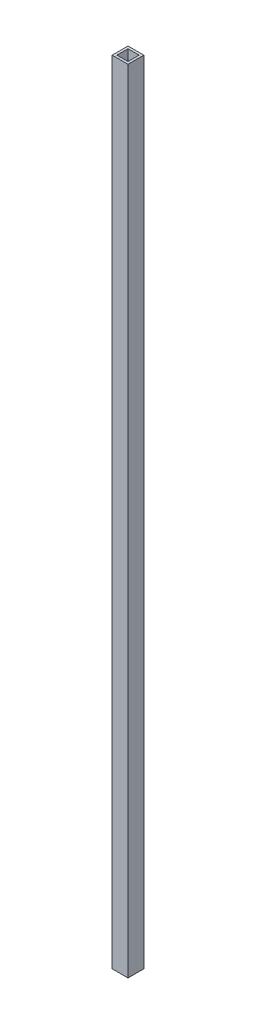
ISO-10303-21;
HEADER;
FILE_DESCRIPTION(('STEP AP214'),'2;1');
FILE_NAME('part.step','',(''),(''),'','','');
FILE_SCHEMA(('AUTOMOTIVE_DESIGN { 1 0 10303 214 1 1 1 1 }'));
ENDSEC;
DATA;
#1=APPLICATION_CONTEXT('core data for automotive mechanical design processes');
#2=APPLICATION_PROTOCOL_DEFINITION('international standard','automotive_design',2000,#1);
#3=PRODUCT_CONTEXT('',#1,'mechanical');
#4=PRODUCT('Part','Part','',(#3));
#5=PRODUCT_RELATED_PRODUCT_CATEGORY('part','',(#4));
#6=PRODUCT_DEFINITION_FORMATION('','',#4);
#7=PRODUCT_DEFINITION_CONTEXT('part definition',#1,'design');
#8=PRODUCT_DEFINITION('design','',#6,#7);
#9=PRODUCT_DEFINITION_SHAPE('','',#8);
#10=(LENGTH_UNIT() NAMED_UNIT(*) SI_UNIT(.MILLI.,.METRE.));
#11=(NAMED_UNIT(*) PLANE_ANGLE_UNIT() SI_UNIT($,.RADIAN.));
#12=(NAMED_UNIT(*) SI_UNIT($,.STERADIAN.) SOLID_ANGLE_UNIT());
#13=UNCERTAINTY_MEASURE_WITH_UNIT(LENGTH_MEASURE(1.E-05),#10,'distance_accuracy_value','');
#14=(GEOMETRIC_REPRESENTATION_CONTEXT(3) GLOBAL_UNCERTAINTY_ASSIGNED_CONTEXT((#13)) GLOBAL_UNIT_ASSIGNED_CONTEXT((#10,
#11,#12)) REPRESENTATION_CONTEXT('',''));
#15=CARTESIAN_POINT('',(0.,0.,0.));
#16=DIRECTION('',(0.,0.,1.));
#17=DIRECTION('',(1.,0.,0.));
#18=AXIS2_PLACEMENT_3D('',#15,#16,#17);
#19=CARTESIAN_POINT('',(0.,1000.,0.));
#20=DIRECTION('',(0.,1.,0.));
#21=DIRECTION('',(0.,0.,1.));
#22=AXIS2_PLACEMENT_3D('',#19,#20,#21);
#23=PLANE('',#22);
#24=DIRECTION('',(0.,0.,-1.));
#25=VECTOR('',#24,1.);
#26=CARTESIAN_POINT('',(10.,1000.,-10.));
#27=LINE('',#26,#25);
#28=CARTESIAN_POINT('',(10.,1000.,10.));
#29=VERTEX_POINT('',#28);
#30=CARTESIAN_POINT('',(10.,1000.,-10.));
#31=VERTEX_POINT('',#30);
#32=EDGE_CURVE('E153',#29,#31,#27,.T.);
#33=ORIENTED_EDGE('',*,*,#32,.T.);
#34=DIRECTION('',(-1.,0.,0.));
#35=VECTOR('',#34,1.);
#36=CARTESIAN_POINT('',(-10.,1000.,-10.));
#37=LINE('',#36,#35);
#38=CARTESIAN_POINT('',(-10.,1000.,-10.));
#39=VERTEX_POINT('',#38);
#40=EDGE_CURVE('E157',#31,#39,#37,.T.);
#41=ORIENTED_EDGE('',*,*,#40,.T.);
#42=DIRECTION('',(0.,0.,1.));
#43=VECTOR('',#42,1.);
#44=CARTESIAN_POINT('',(-10.,1000.,-10.));
#45=LINE('',#44,#43);
#46=CARTESIAN_POINT('',(-10.,1000.,10.));
#47=VERTEX_POINT('',#46);
#48=EDGE_CURVE('E161',#39,#47,#45,.T.);
#49=ORIENTED_EDGE('',*,*,#48,.T.);
#50=DIRECTION('',(1.,0.,0.));
#51=VECTOR('',#50,1.);
#52=CARTESIAN_POINT('',(-10.,1000.,10.));
#53=LINE('',#52,#51);
#54=EDGE_CURVE('E164',#47,#29,#53,.T.);
#55=ORIENTED_EDGE('',*,*,#54,.T.);
#56=EDGE_LOOP('',(#33,#41,#49,#55));
#57=FACE_BOUND('',#56,.T.);
#58=DIRECTION('',(-1.,0.,0.));
#59=VECTOR('',#58,1.);
#60=CARTESIAN_POINT('',(-7.00000000000001,1000.,-7.));
#61=LINE('',#60,#59);
#62=CARTESIAN_POINT('',(7.00000000000001,1000.,-7.));
#63=VERTEX_POINT('',#62);
#64=CARTESIAN_POINT('',(-7.00000000000001,1000.,-7.));
#65=VERTEX_POINT('',#64);
#66=EDGE_CURVE('E114',#63,#65,#61,.T.);
#67=ORIENTED_EDGE('',*,*,#66,.F.);
#68=DIRECTION('',(0.,0.,-1.));
#69=VECTOR('',#68,1.);
#70=CARTESIAN_POINT('',(7.00000000000001,1000.,-7.));
#71=LINE('',#70,#69);
#72=CARTESIAN_POINT('',(7.00000000000001,1000.,7.));
#73=VERTEX_POINT('',#72);
#74=EDGE_CURVE('E105',#73,#63,#71,.T.);
#75=ORIENTED_EDGE('',*,*,#74,.F.);
#76=DIRECTION('',(1.,0.,0.));
#77=VECTOR('',#76,1.);
#78=CARTESIAN_POINT('',(-7.00000000000001,1000.,7.));
#79=LINE('',#78,#77);
#80=CARTESIAN_POINT('',(-7.00000000000001,1000.,7.));
#81=VERTEX_POINT('',#80);
#82=EDGE_CURVE('E131',#81,#73,#79,.T.);
#83=ORIENTED_EDGE('',*,*,#82,.F.);
#84=DIRECTION('',(0.,0.,1.));
#85=VECTOR('',#84,1.);
#86=CARTESIAN_POINT('',(-7.00000000000001,1000.,-7.));
#87=LINE('',#86,#85);
#88=EDGE_CURVE('E127',#65,#81,#87,.T.);
#89=ORIENTED_EDGE('',*,*,#88,.F.);
#90=EDGE_LOOP('',(#67,#75,#83,#89));
#91=FACE_BOUND('',#90,.T.);
#92=ADVANCED_FACE('F39',(#57,#91),#23,.T.);
#93=CARTESIAN_POINT('',(0.,0.,0.));
#94=DIRECTION('',(0.,1.,0.));
#95=DIRECTION('',(0.,0.,1.));
#96=AXIS2_PLACEMENT_3D('',#93,#94,#95);
#97=PLANE('',#96);
#98=DIRECTION('',(0.,0.,-1.));
#99=VECTOR('',#98,1.);
#100=CARTESIAN_POINT('',(10.,0.,-10.));
#101=LINE('',#100,#99);
#102=CARTESIAN_POINT('',(10.,0.,10.));
#103=VERTEX_POINT('',#102);
#104=CARTESIAN_POINT('',(10.,0.,-10.));
#105=VERTEX_POINT('',#104);
#106=EDGE_CURVE('E123',#103,#105,#101,.T.);
#107=ORIENTED_EDGE('',*,*,#106,.F.);
#108=DIRECTION('',(1.,0.,0.));
#109=VECTOR('',#108,1.);
#110=CARTESIAN_POINT('',(-10.,0.,10.));
#111=LINE('',#110,#109);
#112=CARTESIAN_POINT('',(-10.,0.,10.));
#113=VERTEX_POINT('',#112);
#114=EDGE_CURVE('E158',#113,#103,#111,.T.);
#115=ORIENTED_EDGE('',*,*,#114,.F.);
#116=DIRECTION('',(0.,0.,1.));
#117=VECTOR('',#116,1.);
#118=CARTESIAN_POINT('',(-10.,0.,-10.));
#119=LINE('',#118,#117);
#120=CARTESIAN_POINT('',(-10.,0.,-10.));
#121=VERTEX_POINT('',#120);
#122=EDGE_CURVE('E174',#121,#113,#119,.T.);
#123=ORIENTED_EDGE('',*,*,#122,.F.);
#124=DIRECTION('',(-1.,0.,0.));
#125=VECTOR('',#124,1.);
#126=CARTESIAN_POINT('',(-10.,0.,-10.));
#127=LINE('',#126,#125);
#128=EDGE_CURVE('E171',#105,#121,#127,.T.);
#129=ORIENTED_EDGE('',*,*,#128,.F.);
#130=EDGE_LOOP('',(#107,#115,#123,#129));
#131=FACE_BOUND('',#130,.T.);
#132=DIRECTION('',(0.,0.,-1.));
#133=VECTOR('',#132,1.);
#134=CARTESIAN_POINT('',(7.00000000000001,0.,-7.));
#135=LINE('',#134,#133);
#136=CARTESIAN_POINT('',(7.00000000000001,0.,7.));
#137=VERTEX_POINT('',#136);
#138=CARTESIAN_POINT('',(7.00000000000001,0.,-7.));
#139=VERTEX_POINT('',#138);
#140=EDGE_CURVE('E63',#137,#139,#135,.T.);
#141=ORIENTED_EDGE('',*,*,#140,.T.);
#142=DIRECTION('',(-1.,0.,0.));
#143=VECTOR('',#142,1.);
#144=CARTESIAN_POINT('',(-7.00000000000001,0.,-7.));
#145=LINE('',#144,#143);
#146=CARTESIAN_POINT('',(-7.00000000000001,0.,-7.));
#147=VERTEX_POINT('',#146);
#148=EDGE_CURVE('E121',#139,#147,#145,.T.);
#149=ORIENTED_EDGE('',*,*,#148,.T.);
#150=DIRECTION('',(0.,0.,1.));
#151=VECTOR('',#150,1.);
#152=CARTESIAN_POINT('',(-7.00000000000001,0.,-7.));
#153=LINE('',#152,#151);
#154=CARTESIAN_POINT('',(-7.00000000000001,0.,7.));
#155=VERTEX_POINT('',#154);
#156=EDGE_CURVE('E140',#147,#155,#153,.T.);
#157=ORIENTED_EDGE('',*,*,#156,.T.);
#158=DIRECTION('',(1.,0.,0.));
#159=VECTOR('',#158,1.);
#160=CARTESIAN_POINT('',(-7.00000000000001,0.,7.));
#161=LINE('',#160,#159);
#162=EDGE_CURVE('E115',#155,#137,#161,.T.);
#163=ORIENTED_EDGE('',*,*,#162,.T.);
#164=EDGE_LOOP('',(#141,#149,#157,#163));
#165=FACE_BOUND('',#164,.T.);
#166=ADVANCED_FACE('F197',(#131,#165),#97,.F.);
#167=CARTESIAN_POINT('',(10.,1000.,-10.));
#168=DIRECTION('',(-1.,0.,0.));
#169=DIRECTION('',(0.,0.,1.));
#170=AXIS2_PLACEMENT_3D('',#167,#168,#169);
#171=PLANE('',#170);
#172=ORIENTED_EDGE('',*,*,#106,.T.);
#173=DIRECTION('',(0.,-1.,0.));
#174=VECTOR('',#173,1.);
#175=CARTESIAN_POINT('',(10.,1000.,-10.));
#176=LINE('',#175,#174);
#177=EDGE_CURVE('E11',#31,#105,#176,.T.);
#178=ORIENTED_EDGE('',*,*,#177,.F.);
#179=ORIENTED_EDGE('',*,*,#32,.F.);
#180=DIRECTION('',(0.,-1.,0.));
#181=VECTOR('',#180,1.);
#182=CARTESIAN_POINT('',(10.,1000.,10.));
#183=LINE('',#182,#181);
#184=EDGE_CURVE('E167',#29,#103,#183,.T.);
#185=ORIENTED_EDGE('',*,*,#184,.T.);
#186=EDGE_LOOP('',(#172,#178,#179,#185));
#187=FACE_BOUND('',#186,.T.);
#188=ADVANCED_FACE('F41',(#187),#171,.F.);
#189=CARTESIAN_POINT('',(-10.,1000.,-10.));
#190=DIRECTION('',(0.,0.,1.));
#191=DIRECTION('',(1.,0.,0.));
#192=AXIS2_PLACEMENT_3D('',#189,#190,#191);
#193=PLANE('',#192);
#194=ORIENTED_EDGE('',*,*,#128,.T.);
#195=DIRECTION('',(0.,-1.,0.));
#196=VECTOR('',#195,1.);
#197=CARTESIAN_POINT('',(-10.,1000.,-10.));
#198=LINE('',#197,#196);
#199=EDGE_CURVE('E48',#39,#121,#198,.T.);
#200=ORIENTED_EDGE('',*,*,#199,.F.);
#201=ORIENTED_EDGE('',*,*,#40,.F.);
#202=ORIENTED_EDGE('',*,*,#177,.T.);
#203=EDGE_LOOP('',(#194,#200,#201,#202));
#204=FACE_BOUND('',#203,.T.);
#205=ADVANCED_FACE('F207',(#204),#193,.F.);
#206=CARTESIAN_POINT('',(-10.,1000.,-10.));
#207=DIRECTION('',(1.,0.,0.));
#208=DIRECTION('',(0.,0.,-1.));
#209=AXIS2_PLACEMENT_3D('',#206,#207,#208);
#210=PLANE('',#209);
#211=ORIENTED_EDGE('',*,*,#122,.T.);
#212=DIRECTION('',(0.,-1.,0.));
#213=VECTOR('',#212,1.);
#214=CARTESIAN_POINT('',(-10.,1000.,10.));
#215=LINE('',#214,#213);
#216=EDGE_CURVE('E182',#47,#113,#215,.T.);
#217=ORIENTED_EDGE('',*,*,#216,.F.);
#218=ORIENTED_EDGE('',*,*,#48,.F.);
#219=ORIENTED_EDGE('',*,*,#199,.T.);
#220=EDGE_LOOP('',(#211,#217,#218,#219));
#221=FACE_BOUND('',#220,.T.);
#222=ADVANCED_FACE('F191',(#221),#210,.F.);
#223=CARTESIAN_POINT('',(-10.,1000.,10.));
#224=DIRECTION('',(0.,0.,-1.));
#225=DIRECTION('',(-1.,0.,0.));
#226=AXIS2_PLACEMENT_3D('',#223,#224,#225);
#227=PLANE('',#226);
#228=ORIENTED_EDGE('',*,*,#114,.T.);
#229=ORIENTED_EDGE('',*,*,#184,.F.);
#230=ORIENTED_EDGE('',*,*,#54,.F.);
#231=ORIENTED_EDGE('',*,*,#216,.T.);
#232=EDGE_LOOP('',(#228,#229,#230,#231));
#233=FACE_BOUND('',#232,.T.);
#234=ADVANCED_FACE('F201',(#233),#227,.F.);
#235=CARTESIAN_POINT('',(7.00000000000001,1000.,-7.));
#236=DIRECTION('',(-1.,0.,0.));
#237=DIRECTION('',(0.,0.,1.));
#238=AXIS2_PLACEMENT_3D('',#235,#236,#237);
#239=PLANE('',#238);
#240=ORIENTED_EDGE('',*,*,#140,.F.);
#241=DIRECTION('',(0.,-1.,0.));
#242=VECTOR('',#241,1.);
#243=CARTESIAN_POINT('',(7.00000000000001,1000.,7.));
#244=LINE('',#243,#242);
#245=EDGE_CURVE('E109',#73,#137,#244,.T.);
#246=ORIENTED_EDGE('',*,*,#245,.F.);
#247=ORIENTED_EDGE('',*,*,#74,.T.);
#248=DIRECTION('',(0.,-1.,0.));
#249=VECTOR('',#248,1.);
#250=CARTESIAN_POINT('',(7.00000000000001,1000.,-7.));
#251=LINE('',#250,#249);
#252=EDGE_CURVE('E108',#63,#139,#251,.T.);
#253=ORIENTED_EDGE('',*,*,#252,.T.);
#254=EDGE_LOOP('',(#240,#246,#247,#253));
#255=FACE_BOUND('',#254,.T.);
#256=ADVANCED_FACE('F107',(#255),#239,.T.);
#257=CARTESIAN_POINT('',(-7.00000000000001,1000.,-7.));
#258=DIRECTION('',(0.,0.,1.));
#259=DIRECTION('',(1.,0.,0.));
#260=AXIS2_PLACEMENT_3D('',#257,#258,#259);
#261=PLANE('',#260);
#262=ORIENTED_EDGE('',*,*,#148,.F.);
#263=ORIENTED_EDGE('',*,*,#252,.F.);
#264=ORIENTED_EDGE('',*,*,#66,.T.);
#265=DIRECTION('',(0.,-1.,0.));
#266=VECTOR('',#265,1.);
#267=CARTESIAN_POINT('',(-7.00000000000001,1000.,-7.));
#268=LINE('',#267,#266);
#269=EDGE_CURVE('E124',#65,#147,#268,.T.);
#270=ORIENTED_EDGE('',*,*,#269,.T.);
#271=EDGE_LOOP('',(#262,#263,#264,#270));
#272=FACE_BOUND('',#271,.T.);
#273=ADVANCED_FACE('F118',(#272),#261,.T.);
#274=CARTESIAN_POINT('',(-7.00000000000001,1000.,-7.));
#275=DIRECTION('',(1.,0.,0.));
#276=DIRECTION('',(0.,0.,-1.));
#277=AXIS2_PLACEMENT_3D('',#274,#275,#276);
#278=PLANE('',#277);
#279=ORIENTED_EDGE('',*,*,#156,.F.);
#280=ORIENTED_EDGE('',*,*,#269,.F.);
#281=ORIENTED_EDGE('',*,*,#88,.T.);
#282=DIRECTION('',(0.,-1.,0.));
#283=VECTOR('',#282,1.);
#284=CARTESIAN_POINT('',(-7.00000000000001,1000.,7.));
#285=LINE('',#284,#283);
#286=EDGE_CURVE('E55',#81,#155,#285,.T.);
#287=ORIENTED_EDGE('',*,*,#286,.T.);
#288=EDGE_LOOP('',(#279,#280,#281,#287));
#289=FACE_BOUND('',#288,.T.);
#290=ADVANCED_FACE('F230',(#289),#278,.T.);
#291=CARTESIAN_POINT('',(-7.00000000000001,1000.,7.));
#292=DIRECTION('',(0.,0.,-1.));
#293=DIRECTION('',(-1.,0.,0.));
#294=AXIS2_PLACEMENT_3D('',#291,#292,#293);
#295=PLANE('',#294);
#296=ORIENTED_EDGE('',*,*,#162,.F.);
#297=ORIENTED_EDGE('',*,*,#286,.F.);
#298=ORIENTED_EDGE('',*,*,#82,.T.);
#299=ORIENTED_EDGE('',*,*,#245,.T.);
#300=EDGE_LOOP('',(#296,#297,#298,#299));
#301=FACE_BOUND('',#300,.T.);
#302=ADVANCED_FACE('F234',(#301),#295,.T.);
#303=CLOSED_SHELL('',(#92,#166,#188,#205,#222,#234,#256,#273,#290,#302));
#304=MANIFOLD_SOLID_BREP('B2',#303);
#305=ADVANCED_BREP_SHAPE_REPRESENTATION('',(#18,#304),#14);
#306=SHAPE_DEFINITION_REPRESENTATION(#9,#305);
ENDSEC;
END-ISO-10303-21;
